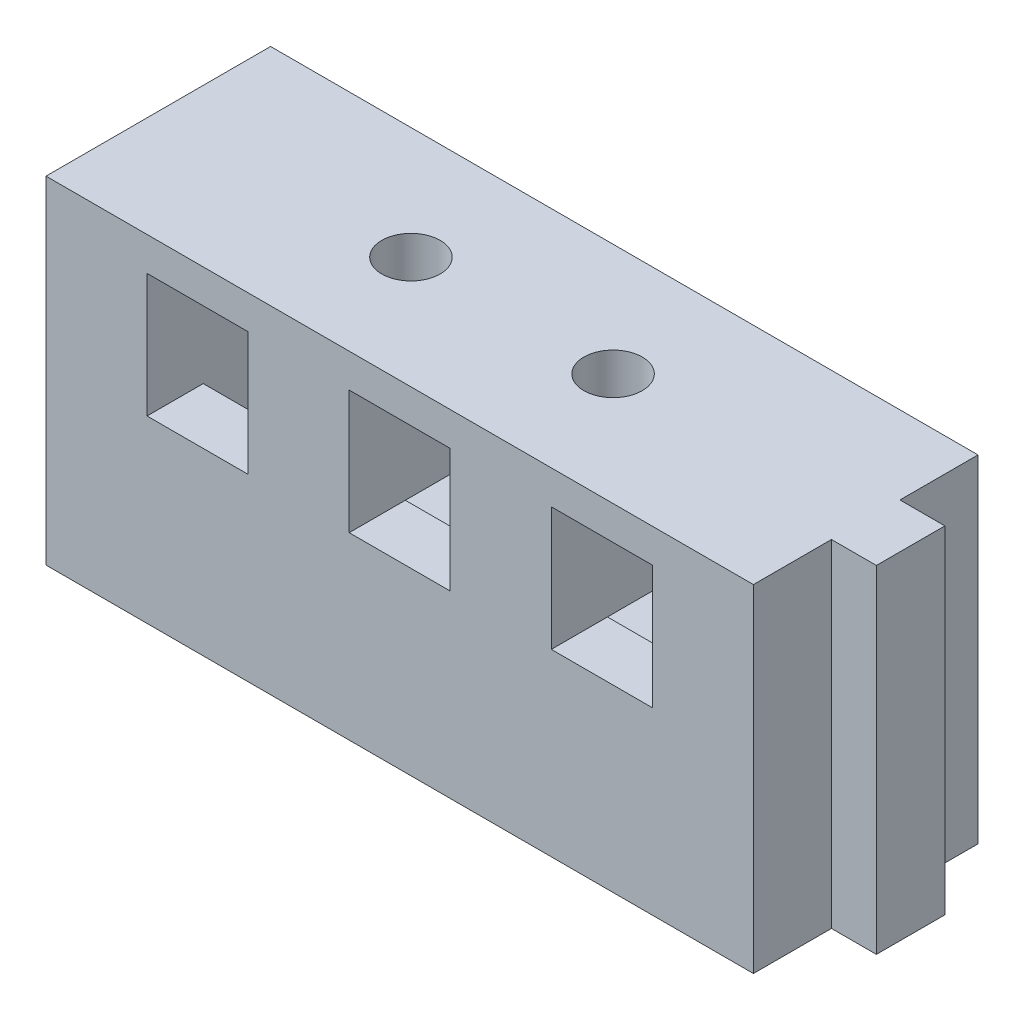
ISO-10303-21;
HEADER;
FILE_DESCRIPTION(('STEP AP214'),'2;1');
FILE_NAME('part.step','',(''),(''),'','','');
FILE_SCHEMA(('AUTOMOTIVE_DESIGN { 1 0 10303 214 1 1 1 1 }'));
ENDSEC;
DATA;
#1=APPLICATION_CONTEXT('core data for automotive mechanical design processes');
#2=APPLICATION_PROTOCOL_DEFINITION('international standard','automotive_design',2000,#1);
#3=PRODUCT_CONTEXT('',#1,'mechanical');
#4=PRODUCT('Part','Part','',(#3));
#5=PRODUCT_RELATED_PRODUCT_CATEGORY('part','',(#4));
#6=PRODUCT_DEFINITION_FORMATION('','',#4);
#7=PRODUCT_DEFINITION_CONTEXT('part definition',#1,'design');
#8=PRODUCT_DEFINITION('design','',#6,#7);
#9=PRODUCT_DEFINITION_SHAPE('','',#8);
#10=(LENGTH_UNIT() NAMED_UNIT(*) SI_UNIT(.MILLI.,.METRE.));
#11=(NAMED_UNIT(*) PLANE_ANGLE_UNIT() SI_UNIT($,.RADIAN.));
#12=(NAMED_UNIT(*) SI_UNIT($,.STERADIAN.) SOLID_ANGLE_UNIT());
#13=UNCERTAINTY_MEASURE_WITH_UNIT(LENGTH_MEASURE(1.E-05),#10,'distance_accuracy_value','');
#14=(GEOMETRIC_REPRESENTATION_CONTEXT(3) GLOBAL_UNCERTAINTY_ASSIGNED_CONTEXT((#13)) GLOBAL_UNIT_ASSIGNED_CONTEXT((#10,
#11,#12)) REPRESENTATION_CONTEXT('',''));
#15=CARTESIAN_POINT('',(0.,0.,0.));
#16=DIRECTION('',(0.,0.,1.));
#17=DIRECTION('',(1.,0.,0.));
#18=AXIS2_PLACEMENT_3D('',#15,#16,#17);
#19=CARTESIAN_POINT('',(50.,0.,20.));
#20=DIRECTION('',(-1.,0.,0.));
#21=DIRECTION('',(0.,0.,1.));
#22=AXIS2_PLACEMENT_3D('',#19,#20,#21);
#23=PLANE('',#22);
#24=DIRECTION('',(0.,1.,0.));
#25=VECTOR('',#24,1.);
#26=CARTESIAN_POINT('',(50.,0.,6.95));
#27=LINE('',#26,#25);
#28=CARTESIAN_POINT('',(50.,0.,6.95));
#29=VERTEX_POINT('',#28);
#30=CARTESIAN_POINT('',(50.,30.,6.95));
#31=VERTEX_POINT('',#30);
#32=EDGE_CURVE('E59',#29,#31,#27,.T.);
#33=ORIENTED_EDGE('',*,*,#32,.F.);
#34=DIRECTION('',(0.,0.,-1.));
#35=VECTOR('',#34,1.);
#36=CARTESIAN_POINT('',(50.,0.,20.));
#37=LINE('',#36,#35);
#38=CARTESIAN_POINT('',(50.,0.,0.));
#39=VERTEX_POINT('',#38);
#40=EDGE_CURVE('E493',#29,#39,#37,.T.);
#41=ORIENTED_EDGE('',*,*,#40,.T.);
#42=DIRECTION('',(0.,1.,0.));
#43=VECTOR('',#42,1.);
#44=CARTESIAN_POINT('',(50.,0.,0.));
#45=LINE('',#44,#43);
#46=CARTESIAN_POINT('',(50.,30.,0.));
#47=VERTEX_POINT('',#46);
#48=EDGE_CURVE('E467',#39,#47,#45,.T.);
#49=ORIENTED_EDGE('',*,*,#48,.T.);
#50=DIRECTION('',(0.,0.,-1.));
#51=VECTOR('',#50,1.);
#52=CARTESIAN_POINT('',(50.,30.,20.));
#53=LINE('',#52,#51);
#54=EDGE_CURVE('E476',#31,#47,#53,.T.);
#55=ORIENTED_EDGE('',*,*,#54,.F.);
#56=EDGE_LOOP('',(#33,#41,#49,#55));
#57=FACE_BOUND('',#56,.T.);
#58=ADVANCED_FACE('F41',(#57),#23,.F.);
#59=CARTESIAN_POINT('',(9.5,100.,10.));
#60=DIRECTION('',(0.,-1.,0.));
#61=DIRECTION('',(0.,0.,-1.));
#62=AXIS2_PLACEMENT_3D('',#59,#60,#61);
#63=CYLINDRICAL_SURFACE('',#62,2.6);
#64=CARTESIAN_POINT('',(9.5,0.,10.));
#65=DIRECTION('',(0.,-1.,0.));
#66=DIRECTION('',(0.,0.,-1.));
#67=AXIS2_PLACEMENT_3D('',#64,#65,#66);
#68=CIRCLE('',#67,2.6);
#69=CARTESIAN_POINT('',(9.5,0.,7.4));
#70=VERTEX_POINT('',#69);
#71=EDGE_CURVE('E277',#70,#70,#68,.T.);
#72=ORIENTED_EDGE('',*,*,#71,.T.);
#73=EDGE_LOOP('',(#72));
#74=FACE_BOUND('',#73,.T.);
#75=CARTESIAN_POINT('',(9.5,3.,10.));
#76=DIRECTION('',(0.,1.,0.));
#77=DIRECTION('',(0.,0.,1.));
#78=AXIS2_PLACEMENT_3D('',#75,#76,#77);
#79=CIRCLE('',#78,2.6);
#80=CARTESIAN_POINT('',(9.5,3.,12.6));
#81=VERTEX_POINT('',#80);
#82=EDGE_CURVE('E45',#81,#81,#79,.F.);
#83=ORIENTED_EDGE('',*,*,#82,.F.);
#84=EDGE_LOOP('',(#83));
#85=FACE_BOUND('',#84,.T.);
#86=ADVANCED_FACE('F508',(#74,#85),#63,.F.);
#87=CARTESIAN_POINT('',(27.5,100.,10.));
#88=DIRECTION('',(0.,-1.,0.));
#89=DIRECTION('',(0.,0.,-1.));
#90=AXIS2_PLACEMENT_3D('',#87,#88,#89);
#91=CYLINDRICAL_SURFACE('',#90,2.6);
#92=CARTESIAN_POINT('',(27.5,0.,10.));
#93=DIRECTION('',(0.,-1.,0.));
#94=DIRECTION('',(0.,0.,-1.));
#95=AXIS2_PLACEMENT_3D('',#92,#93,#94);
#96=CIRCLE('',#95,2.6);
#97=CARTESIAN_POINT('',(27.5,0.,7.4));
#98=VERTEX_POINT('',#97);
#99=EDGE_CURVE('E272',#98,#98,#96,.T.);
#100=ORIENTED_EDGE('',*,*,#99,.T.);
#101=EDGE_LOOP('',(#100));
#102=FACE_BOUND('',#101,.T.);
#103=CARTESIAN_POINT('',(27.5,3.,10.));
#104=DIRECTION('',(0.,1.,0.));
#105=DIRECTION('',(0.,0.,1.));
#106=AXIS2_PLACEMENT_3D('',#103,#104,#105);
#107=CIRCLE('',#106,2.6);
#108=CARTESIAN_POINT('',(27.5,3.,12.6));
#109=VERTEX_POINT('',#108);
#110=EDGE_CURVE('E262',#109,#109,#107,.F.);
#111=ORIENTED_EDGE('',*,*,#110,.F.);
#112=EDGE_LOOP('',(#111));
#113=FACE_BOUND('',#112,.T.);
#114=ADVANCED_FACE('F510',(#102,#113),#91,.F.);
#115=CARTESIAN_POINT('',(-13.,30.,20.));
#116=DIRECTION('',(1.,0.,0.));
#117=DIRECTION('',(0.,0.,-1.));
#118=AXIS2_PLACEMENT_3D('',#115,#116,#117);
#119=PLANE('',#118);
#120=DIRECTION('',(0.,-1.,0.));
#121=VECTOR('',#120,1.);
#122=CARTESIAN_POINT('',(-13.,30.,0.));
#123=LINE('',#122,#121);
#124=CARTESIAN_POINT('',(-13.,30.,0.));
#125=VERTEX_POINT('',#124);
#126=CARTESIAN_POINT('',(-13.,0.,0.));
#127=VERTEX_POINT('',#126);
#128=EDGE_CURVE('E480',#125,#127,#123,.T.);
#129=ORIENTED_EDGE('',*,*,#128,.T.);
#130=DIRECTION('',(0.,0.,-1.));
#131=VECTOR('',#130,1.);
#132=CARTESIAN_POINT('',(-13.,0.,20.));
#133=LINE('',#132,#131);
#134=CARTESIAN_POINT('',(-13.,0.,20.));
#135=VERTEX_POINT('',#134);
#136=EDGE_CURVE('E51',#135,#127,#133,.T.);
#137=ORIENTED_EDGE('',*,*,#136,.F.);
#138=DIRECTION('',(0.,-1.,0.));
#139=VECTOR('',#138,1.);
#140=CARTESIAN_POINT('',(-13.,30.,20.));
#141=LINE('',#140,#139);
#142=CARTESIAN_POINT('',(-13.,30.,20.));
#143=VERTEX_POINT('',#142);
#144=EDGE_CURVE('E466',#143,#135,#141,.T.);
#145=ORIENTED_EDGE('',*,*,#144,.F.);
#146=DIRECTION('',(0.,0.,-1.));
#147=VECTOR('',#146,1.);
#148=CARTESIAN_POINT('',(-13.,30.,20.));
#149=LINE('',#148,#147);
#150=EDGE_CURVE('E11',#143,#125,#149,.T.);
#151=ORIENTED_EDGE('',*,*,#150,.T.);
#152=EDGE_LOOP('',(#129,#137,#145,#151));
#153=FACE_BOUND('',#152,.T.);
#154=ADVANCED_FACE('F518',(#153),#119,.F.);
#155=CARTESIAN_POINT('',(50.,0.,20.));
#156=VERTEX_POINT('',#155);
#157=CARTESIAN_POINT('',(50.,0.,13.05));
#158=VERTEX_POINT('',#157);
#159=EDGE_CURVE('E67',#156,#158,#37,.T.);
#160=ORIENTED_EDGE('',*,*,#159,.T.);
#161=DIRECTION('',(0.,1.,0.));
#162=VECTOR('',#161,1.);
#163=CARTESIAN_POINT('',(50.,0.,13.05));
#164=LINE('',#163,#162);
#165=CARTESIAN_POINT('',(50.,30.,13.05));
#166=VERTEX_POINT('',#165);
#167=EDGE_CURVE('E218',#158,#166,#164,.T.);
#168=ORIENTED_EDGE('',*,*,#167,.T.);
#169=CARTESIAN_POINT('',(50.,30.,20.));
#170=VERTEX_POINT('',#169);
#171=EDGE_CURVE('E489',#170,#166,#53,.T.);
#172=ORIENTED_EDGE('',*,*,#171,.F.);
#173=DIRECTION('',(0.,1.,0.));
#174=VECTOR('',#173,1.);
#175=CARTESIAN_POINT('',(50.,0.,20.));
#176=LINE('',#175,#174);
#177=EDGE_CURVE('E473',#156,#170,#176,.T.);
#178=ORIENTED_EDGE('',*,*,#177,.F.);
#179=EDGE_LOOP('',(#160,#168,#172,#178));
#180=FACE_BOUND('',#179,.T.);
#181=ADVANCED_FACE('F523',(#180),#23,.F.);
#182=CARTESIAN_POINT('',(14.,15.9999999999999,20.));
#183=DIRECTION('',(0.,1.,0.));
#184=DIRECTION('',(0.,0.,1.));
#185=AXIS2_PLACEMENT_3D('',#182,#183,#184);
#186=PLANE('',#185);
#187=DIRECTION('',(0.,0.,-1.));
#188=VECTOR('',#187,1.);
#189=CARTESIAN_POINT('',(23.,15.9999999999999,20.));
#190=LINE('',#189,#188);
#191=CARTESIAN_POINT('',(23.,15.9999999999999,20.));
#192=VERTEX_POINT('',#191);
#193=CARTESIAN_POINT('',(23.,15.9999999999998,15.));
#194=VERTEX_POINT('',#193);
#195=EDGE_CURVE('E453',#192,#194,#190,.T.);
#196=ORIENTED_EDGE('',*,*,#195,.T.);
#197=DIRECTION('',(1.,0.,0.));
#198=VECTOR('',#197,1.);
#199=CARTESIAN_POINT('',(0.,15.9999999999998,15.));
#200=LINE('',#199,#198);
#201=CARTESIAN_POINT('',(14.,15.9999999999998,15.));
#202=VERTEX_POINT('',#201);
#203=EDGE_CURVE('E666',#202,#194,#200,.T.);
#204=ORIENTED_EDGE('',*,*,#203,.F.);
#205=DIRECTION('',(0.,0.,-1.));
#206=VECTOR('',#205,1.);
#207=CARTESIAN_POINT('',(14.,15.9999999999999,20.));
#208=LINE('',#207,#206);
#209=CARTESIAN_POINT('',(14.,15.9999999999999,20.));
#210=VERTEX_POINT('',#209);
#211=EDGE_CURVE('E457',#210,#202,#208,.T.);
#212=ORIENTED_EDGE('',*,*,#211,.F.);
#213=DIRECTION('',(1.,0.,0.));
#214=VECTOR('',#213,1.);
#215=CARTESIAN_POINT('',(14.,15.9999999999999,20.));
#216=LINE('',#215,#214);
#217=EDGE_CURVE('E425',#210,#192,#216,.T.);
#218=ORIENTED_EDGE('',*,*,#217,.T.);
#219=EDGE_LOOP('',(#196,#204,#212,#218));
#220=FACE_BOUND('',#219,.T.);
#221=ADVANCED_FACE('F559',(#220),#186,.T.);
#222=CARTESIAN_POINT('',(-4.,15.9999999999998,20.));
#223=DIRECTION('',(0.,1.,0.));
#224=DIRECTION('',(0.,0.,1.));
#225=AXIS2_PLACEMENT_3D('',#222,#223,#224);
#226=PLANE('',#225);
#227=DIRECTION('',(0.,0.,-1.));
#228=VECTOR('',#227,1.);
#229=CARTESIAN_POINT('',(5.,15.9999999999998,20.));
#230=LINE('',#229,#228);
#231=CARTESIAN_POINT('',(5.,15.9999999999998,20.));
#232=VERTEX_POINT('',#231);
#233=CARTESIAN_POINT('',(5.,15.9999999999998,15.));
#234=VERTEX_POINT('',#233);
#235=EDGE_CURVE('E413',#232,#234,#230,.T.);
#236=ORIENTED_EDGE('',*,*,#235,.T.);
#237=CARTESIAN_POINT('',(-4.,15.9999999999998,15.));
#238=VERTEX_POINT('',#237);
#239=EDGE_CURVE('E324',#238,#234,#200,.T.);
#240=ORIENTED_EDGE('',*,*,#239,.F.);
#241=DIRECTION('',(0.,0.,-1.));
#242=VECTOR('',#241,1.);
#243=CARTESIAN_POINT('',(-4.,15.9999999999998,20.));
#244=LINE('',#243,#242);
#245=CARTESIAN_POINT('',(-4.,15.9999999999998,20.));
#246=VERTEX_POINT('',#245);
#247=EDGE_CURVE('E417',#246,#238,#244,.T.);
#248=ORIENTED_EDGE('',*,*,#247,.F.);
#249=DIRECTION('',(1.,0.,0.));
#250=VECTOR('',#249,1.);
#251=CARTESIAN_POINT('',(-4.,15.9999999999998,20.));
#252=LINE('',#251,#250);
#253=EDGE_CURVE('E386',#246,#232,#252,.T.);
#254=ORIENTED_EDGE('',*,*,#253,.T.);
#255=EDGE_LOOP('',(#236,#240,#248,#254));
#256=FACE_BOUND('',#255,.T.);
#257=ADVANCED_FACE('F564',(#256),#226,.T.);
#258=CARTESIAN_POINT('',(32.,16.,20.));
#259=DIRECTION('',(0.,1.,0.));
#260=DIRECTION('',(0.,0.,1.));
#261=AXIS2_PLACEMENT_3D('',#258,#259,#260);
#262=PLANE('',#261);
#263=DIRECTION('',(0.,0.,-1.));
#264=VECTOR('',#263,1.);
#265=CARTESIAN_POINT('',(41.,16.,20.));
#266=LINE('',#265,#264);
#267=CARTESIAN_POINT('',(41.,16.,20.));
#268=VERTEX_POINT('',#267);
#269=CARTESIAN_POINT('',(41.,15.9999999999998,15.));
#270=VERTEX_POINT('',#269);
#271=EDGE_CURVE('E375',#268,#270,#266,.T.);
#272=ORIENTED_EDGE('',*,*,#271,.T.);
#273=CARTESIAN_POINT('',(32.,15.9999999999998,15.));
#274=VERTEX_POINT('',#273);
#275=EDGE_CURVE('E317',#274,#270,#200,.T.);
#276=ORIENTED_EDGE('',*,*,#275,.F.);
#277=DIRECTION('',(0.,0.,-1.));
#278=VECTOR('',#277,1.);
#279=CARTESIAN_POINT('',(32.,16.,20.));
#280=LINE('',#279,#278);
#281=CARTESIAN_POINT('',(32.,16.,20.));
#282=VERTEX_POINT('',#281);
#283=EDGE_CURVE('E378',#282,#274,#280,.T.);
#284=ORIENTED_EDGE('',*,*,#283,.F.);
#285=DIRECTION('',(1.,0.,0.));
#286=VECTOR('',#285,1.);
#287=CARTESIAN_POINT('',(32.,16.,20.));
#288=LINE('',#287,#286);
#289=EDGE_CURVE('E347',#282,#268,#288,.T.);
#290=ORIENTED_EDGE('',*,*,#289,.T.);
#291=EDGE_LOOP('',(#272,#276,#284,#290));
#292=FACE_BOUND('',#291,.T.);
#293=ADVANCED_FACE('F590',(#292),#262,.T.);
#294=CARTESIAN_POINT('',(0.,0.,20.));
#295=DIRECTION('',(0.,0.,1.));
#296=DIRECTION('',(1.,0.,0.));
#297=AXIS2_PLACEMENT_3D('',#294,#295,#296);
#298=PLANE('',#297);
#299=DIRECTION('',(-1.,0.,0.));
#300=VECTOR('',#299,1.);
#301=CARTESIAN_POINT('',(-13.,30.,20.));
#302=LINE('',#301,#300);
#303=EDGE_CURVE('E462',#170,#143,#302,.T.);
#304=ORIENTED_EDGE('',*,*,#303,.T.);
#305=ORIENTED_EDGE('',*,*,#144,.T.);
#306=DIRECTION('',(1.,0.,0.));
#307=VECTOR('',#306,1.);
#308=CARTESIAN_POINT('',(-13.,0.,20.));
#309=LINE('',#308,#307);
#310=EDGE_CURVE('E470',#135,#156,#309,.T.);
#311=ORIENTED_EDGE('',*,*,#310,.T.);
#312=ORIENTED_EDGE('',*,*,#177,.T.);
#313=EDGE_LOOP('',(#304,#305,#311,#312));
#314=FACE_BOUND('',#313,.T.);
#315=ORIENTED_EDGE('',*,*,#217,.F.);
#316=DIRECTION('',(0.,-1.,0.));
#317=VECTOR('',#316,1.);
#318=CARTESIAN_POINT('',(14.,26.9999999999999,20.));
#319=LINE('',#318,#317);
#320=CARTESIAN_POINT('',(14.,26.9999999999999,20.));
#321=VERTEX_POINT('',#320);
#322=EDGE_CURVE('E422',#321,#210,#319,.T.);
#323=ORIENTED_EDGE('',*,*,#322,.F.);
#324=DIRECTION('',(-1.,0.,0.));
#325=VECTOR('',#324,1.);
#326=CARTESIAN_POINT('',(14.,26.9999999999999,20.));
#327=LINE('',#326,#325);
#328=CARTESIAN_POINT('',(23.,26.9999999999999,20.));
#329=VERTEX_POINT('',#328);
#330=EDGE_CURVE('E433',#329,#321,#327,.T.);
#331=ORIENTED_EDGE('',*,*,#330,.F.);
#332=DIRECTION('',(0.,1.,0.));
#333=VECTOR('',#332,1.);
#334=CARTESIAN_POINT('',(23.,26.9999999999999,20.));
#335=LINE('',#334,#333);
#336=EDGE_CURVE('E429',#192,#329,#335,.T.);
#337=ORIENTED_EDGE('',*,*,#336,.F.);
#338=EDGE_LOOP('',(#315,#323,#331,#337));
#339=FACE_BOUND('',#338,.T.);
#340=ORIENTED_EDGE('',*,*,#253,.F.);
#341=DIRECTION('',(0.,-1.,0.));
#342=VECTOR('',#341,1.);
#343=CARTESIAN_POINT('',(-4.,26.9999999999998,20.));
#344=LINE('',#343,#342);
#345=CARTESIAN_POINT('',(-4.,26.9999999999998,20.));
#346=VERTEX_POINT('',#345);
#347=EDGE_CURVE('E383',#346,#246,#344,.T.);
#348=ORIENTED_EDGE('',*,*,#347,.F.);
#349=DIRECTION('',(-1.,0.,0.));
#350=VECTOR('',#349,1.);
#351=CARTESIAN_POINT('',(-4.,26.9999999999998,20.));
#352=LINE('',#351,#350);
#353=CARTESIAN_POINT('',(5.,26.9999999999998,20.));
#354=VERTEX_POINT('',#353);
#355=EDGE_CURVE('E394',#354,#346,#352,.T.);
#356=ORIENTED_EDGE('',*,*,#355,.F.);
#357=DIRECTION('',(0.,1.,0.));
#358=VECTOR('',#357,1.);
#359=CARTESIAN_POINT('',(5.,26.9999999999998,20.));
#360=LINE('',#359,#358);
#361=EDGE_CURVE('E390',#232,#354,#360,.T.);
#362=ORIENTED_EDGE('',*,*,#361,.F.);
#363=EDGE_LOOP('',(#340,#348,#356,#362));
#364=FACE_BOUND('',#363,.T.);
#365=ORIENTED_EDGE('',*,*,#289,.F.);
#366=DIRECTION('',(0.,-1.,0.));
#367=VECTOR('',#366,1.);
#368=CARTESIAN_POINT('',(32.,27.,20.));
#369=LINE('',#368,#367);
#370=CARTESIAN_POINT('',(32.,27.,20.));
#371=VERTEX_POINT('',#370);
#372=EDGE_CURVE('E344',#371,#282,#369,.T.);
#373=ORIENTED_EDGE('',*,*,#372,.F.);
#374=DIRECTION('',(-1.,0.,0.));
#375=VECTOR('',#374,1.);
#376=CARTESIAN_POINT('',(32.,27.,20.));
#377=LINE('',#376,#375);
#378=CARTESIAN_POINT('',(41.,27.,20.));
#379=VERTEX_POINT('',#378);
#380=EDGE_CURVE('E355',#379,#371,#377,.T.);
#381=ORIENTED_EDGE('',*,*,#380,.F.);
#382=DIRECTION('',(0.,1.,0.));
#383=VECTOR('',#382,1.);
#384=CARTESIAN_POINT('',(41.,27.,20.));
#385=LINE('',#384,#383);
#386=EDGE_CURVE('E351',#268,#379,#385,.T.);
#387=ORIENTED_EDGE('',*,*,#386,.F.);
#388=EDGE_LOOP('',(#365,#373,#381,#387));
#389=FACE_BOUND('',#388,.T.);
#390=ADVANCED_FACE('F555',(#314,#339,#364,#389),#298,.T.);
#391=CARTESIAN_POINT('',(0.,0.,0.));
#392=DIRECTION('',(0.,0.,1.));
#393=DIRECTION('',(1.,0.,0.));
#394=AXIS2_PLACEMENT_3D('',#391,#392,#393);
#395=PLANE('',#394);
#396=DIRECTION('',(0.,-1.,0.));
#397=VECTOR('',#396,1.);
#398=CARTESIAN_POINT('',(-4.,26.9999999999998,0.));
#399=LINE('',#398,#397);
#400=CARTESIAN_POINT('',(-4.,26.9999999999998,0.));
#401=VERTEX_POINT('',#400);
#402=CARTESIAN_POINT('',(-4.,5.,0.));
#403=VERTEX_POINT('',#402);
#404=EDGE_CURVE('E382',#401,#403,#399,.T.);
#405=ORIENTED_EDGE('',*,*,#404,.T.);
#406=DIRECTION('',(1.,0.,0.));
#407=VECTOR('',#406,1.);
#408=CARTESIAN_POINT('',(0.,5.,0.));
#409=LINE('',#408,#407);
#410=CARTESIAN_POINT('',(41.,5.,0.));
#411=VERTEX_POINT('',#410);
#412=EDGE_CURVE('E312',#403,#411,#409,.T.);
#413=ORIENTED_EDGE('',*,*,#412,.T.);
#414=DIRECTION('',(0.,1.,0.));
#415=VECTOR('',#414,1.);
#416=CARTESIAN_POINT('',(41.,27.,0.));
#417=LINE('',#416,#415);
#418=CARTESIAN_POINT('',(41.,27.,0.));
#419=VERTEX_POINT('',#418);
#420=EDGE_CURVE('E362',#411,#419,#417,.T.);
#421=ORIENTED_EDGE('',*,*,#420,.T.);
#422=DIRECTION('',(-1.,0.,0.));
#423=VECTOR('',#422,1.);
#424=CARTESIAN_POINT('',(32.,27.,0.));
#425=LINE('',#424,#423);
#426=CARTESIAN_POINT('',(32.,27.,0.));
#427=VERTEX_POINT('',#426);
#428=EDGE_CURVE('E348',#419,#427,#425,.T.);
#429=ORIENTED_EDGE('',*,*,#428,.T.);
#430=DIRECTION('',(0.,-1.,0.));
#431=VECTOR('',#430,1.);
#432=CARTESIAN_POINT('',(32.,27.,0.));
#433=LINE('',#432,#431);
#434=CARTESIAN_POINT('',(32.,15.9999999999998,0.));
#435=VERTEX_POINT('',#434);
#436=EDGE_CURVE('E343',#427,#435,#433,.T.);
#437=ORIENTED_EDGE('',*,*,#436,.T.);
#438=DIRECTION('',(1.,0.,0.));
#439=VECTOR('',#438,1.);
#440=CARTESIAN_POINT('',(0.,15.9999999999998,0.));
#441=LINE('',#440,#439);
#442=CARTESIAN_POINT('',(23.,15.9999999999998,0.));
#443=VERTEX_POINT('',#442);
#444=EDGE_CURVE('E327',#443,#435,#441,.T.);
#445=ORIENTED_EDGE('',*,*,#444,.F.);
#446=DIRECTION('',(0.,1.,0.));
#447=VECTOR('',#446,1.);
#448=CARTESIAN_POINT('',(23.,26.9999999999999,0.));
#449=LINE('',#448,#447);
#450=CARTESIAN_POINT('',(23.,26.9999999999999,0.));
#451=VERTEX_POINT('',#450);
#452=EDGE_CURVE('E440',#443,#451,#449,.T.);
#453=ORIENTED_EDGE('',*,*,#452,.T.);
#454=DIRECTION('',(-1.,0.,0.));
#455=VECTOR('',#454,1.);
#456=CARTESIAN_POINT('',(14.,26.9999999999999,0.));
#457=LINE('',#456,#455);
#458=CARTESIAN_POINT('',(14.,26.9999999999999,0.));
#459=VERTEX_POINT('',#458);
#460=EDGE_CURVE('E426',#451,#459,#457,.T.);
#461=ORIENTED_EDGE('',*,*,#460,.T.);
#462=DIRECTION('',(0.,-1.,0.));
#463=VECTOR('',#462,1.);
#464=CARTESIAN_POINT('',(14.,26.9999999999999,0.));
#465=LINE('',#464,#463);
#466=CARTESIAN_POINT('',(14.,15.9999999999998,0.));
#467=VERTEX_POINT('',#466);
#468=EDGE_CURVE('E421',#459,#467,#465,.T.);
#469=ORIENTED_EDGE('',*,*,#468,.T.);
#470=CARTESIAN_POINT('',(5.,15.9999999999998,0.));
#471=VERTEX_POINT('',#470);
#472=EDGE_CURVE('E330',#471,#467,#441,.T.);
#473=ORIENTED_EDGE('',*,*,#472,.F.);
#474=DIRECTION('',(0.,1.,0.));
#475=VECTOR('',#474,1.);
#476=CARTESIAN_POINT('',(5.,26.9999999999998,0.));
#477=LINE('',#476,#475);
#478=CARTESIAN_POINT('',(5.,26.9999999999998,0.));
#479=VERTEX_POINT('',#478);
#480=EDGE_CURVE('E400',#471,#479,#477,.T.);
#481=ORIENTED_EDGE('',*,*,#480,.T.);
#482=DIRECTION('',(-1.,0.,0.));
#483=VECTOR('',#482,1.);
#484=CARTESIAN_POINT('',(-4.,26.9999999999998,0.));
#485=LINE('',#484,#483);
#486=EDGE_CURVE('E387',#479,#401,#485,.T.);
#487=ORIENTED_EDGE('',*,*,#486,.T.);
#488=EDGE_LOOP('',(#405,#413,#421,#429,#437,#445,#453,#461,#469,#473,#481,#487));
#489=FACE_BOUND('',#488,.T.);
#490=DIRECTION('',(-1.,0.,0.));
#491=VECTOR('',#490,1.);
#492=CARTESIAN_POINT('',(-13.,30.,0.));
#493=LINE('',#492,#491);
#494=EDGE_CURVE('E461',#47,#125,#493,.T.);
#495=ORIENTED_EDGE('',*,*,#494,.F.);
#496=ORIENTED_EDGE('',*,*,#48,.F.);
#497=DIRECTION('',(1.,0.,0.));
#498=VECTOR('',#497,1.);
#499=CARTESIAN_POINT('',(-13.,0.,0.));
#500=LINE('',#499,#498);
#501=EDGE_CURVE('E483',#127,#39,#500,.T.);
#502=ORIENTED_EDGE('',*,*,#501,.F.);
#503=ORIENTED_EDGE('',*,*,#128,.F.);
#504=EDGE_LOOP('',(#495,#496,#502,#503));
#505=FACE_BOUND('',#504,.T.);
#506=ADVANCED_FACE('F543',(#489,#505),#395,.F.);
#507=CARTESIAN_POINT('',(-13.,30.,20.));
#508=DIRECTION('',(0.,-1.,0.));
#509=DIRECTION('',(0.,0.,-1.));
#510=AXIS2_PLACEMENT_3D('',#507,#508,#509);
#511=PLANE('',#510);
#512=CARTESIAN_POINT('',(27.5,30.,10.));
#513=DIRECTION('',(0.,-1.,0.));
#514=DIRECTION('',(0.,0.,-1.));
#515=AXIS2_PLACEMENT_3D('',#512,#513,#514);
#516=CIRCLE('',#515,2.6);
#517=CARTESIAN_POINT('',(27.5,30.,7.4));
#518=VERTEX_POINT('',#517);
#519=EDGE_CURVE('E292',#518,#518,#516,.T.);
#520=ORIENTED_EDGE('',*,*,#519,.T.);
#521=EDGE_LOOP('',(#520));
#522=FACE_BOUND('',#521,.T.);
#523=CARTESIAN_POINT('',(9.5,30.,10.));
#524=DIRECTION('',(0.,-1.,0.));
#525=DIRECTION('',(0.,0.,-1.));
#526=AXIS2_PLACEMENT_3D('',#523,#524,#525);
#527=CIRCLE('',#526,2.6);
#528=CARTESIAN_POINT('',(9.5,30.,7.4));
#529=VERTEX_POINT('',#528);
#530=EDGE_CURVE('E284',#529,#529,#527,.T.);
#531=ORIENTED_EDGE('',*,*,#530,.T.);
#532=EDGE_LOOP('',(#531));
#533=FACE_BOUND('',#532,.T.);
#534=ORIENTED_EDGE('',*,*,#494,.T.);
#535=ORIENTED_EDGE('',*,*,#150,.F.);
#536=ORIENTED_EDGE('',*,*,#303,.F.);
#537=ORIENTED_EDGE('',*,*,#171,.T.);
#538=DIRECTION('',(-1.,0.,0.));
#539=VECTOR('',#538,1.);
#540=CARTESIAN_POINT('',(54.,30.,13.05));
#541=LINE('',#540,#539);
#542=CARTESIAN_POINT('',(54.,30.,13.05));
#543=VERTEX_POINT('',#542);
#544=EDGE_CURVE('E247',#543,#166,#541,.T.);
#545=ORIENTED_EDGE('',*,*,#544,.F.);
#546=DIRECTION('',(0.,0.,1.));
#547=VECTOR('',#546,1.);
#548=CARTESIAN_POINT('',(54.,30.,0.));
#549=LINE('',#548,#547);
#550=CARTESIAN_POINT('',(54.,30.,6.95));
#551=VERTEX_POINT('',#550);
#552=EDGE_CURVE('E236',#551,#543,#549,.T.);
#553=ORIENTED_EDGE('',*,*,#552,.F.);
#554=DIRECTION('',(-1.,0.,0.));
#555=VECTOR('',#554,1.);
#556=CARTESIAN_POINT('',(54.,30.,6.95));
#557=LINE('',#556,#555);
#558=EDGE_CURVE('E252',#551,#31,#557,.T.);
#559=ORIENTED_EDGE('',*,*,#558,.T.);
#560=ORIENTED_EDGE('',*,*,#54,.T.);
#561=EDGE_LOOP('',(#534,#535,#536,#537,#545,#553,#559,#560));
#562=FACE_BOUND('',#561,.T.);
#563=ADVANCED_FACE('F43',(#522,#533,#562),#511,.F.);
#564=CARTESIAN_POINT('',(-13.,0.,20.));
#565=DIRECTION('',(0.,1.,0.));
#566=DIRECTION('',(0.,0.,1.));
#567=AXIS2_PLACEMENT_3D('',#564,#565,#566);
#568=PLANE('',#567);
#569=ORIENTED_EDGE('',*,*,#99,.F.);
#570=EDGE_LOOP('',(#569));
#571=FACE_BOUND('',#570,.T.);
#572=ORIENTED_EDGE('',*,*,#71,.F.);
#573=EDGE_LOOP('',(#572));
#574=FACE_BOUND('',#573,.T.);
#575=ORIENTED_EDGE('',*,*,#501,.T.);
#576=ORIENTED_EDGE('',*,*,#40,.F.);
#577=DIRECTION('',(-1.,0.,0.));
#578=VECTOR('',#577,1.);
#579=CARTESIAN_POINT('',(54.,0.,6.95));
#580=LINE('',#579,#578);
#581=CARTESIAN_POINT('',(54.,0.,6.95));
#582=VERTEX_POINT('',#581);
#583=EDGE_CURVE('E222',#582,#29,#580,.T.);
#584=ORIENTED_EDGE('',*,*,#583,.F.);
#585=DIRECTION('',(0.,0.,-1.));
#586=VECTOR('',#585,1.);
#587=CARTESIAN_POINT('',(54.,0.,0.));
#588=LINE('',#587,#586);
#589=CARTESIAN_POINT('',(54.,0.,13.05));
#590=VERTEX_POINT('',#589);
#591=EDGE_CURVE('E225',#590,#582,#588,.T.);
#592=ORIENTED_EDGE('',*,*,#591,.F.);
#593=DIRECTION('',(-1.,0.,0.));
#594=VECTOR('',#593,1.);
#595=CARTESIAN_POINT('',(54.,0.,13.05));
#596=LINE('',#595,#594);
#597=EDGE_CURVE('E212',#590,#158,#596,.T.);
#598=ORIENTED_EDGE('',*,*,#597,.T.);
#599=ORIENTED_EDGE('',*,*,#159,.F.);
#600=ORIENTED_EDGE('',*,*,#310,.F.);
#601=ORIENTED_EDGE('',*,*,#136,.T.);
#602=EDGE_LOOP('',(#575,#576,#584,#592,#598,#599,#600,#601));
#603=FACE_BOUND('',#602,.T.);
#604=ADVANCED_FACE('F227',(#571,#574,#603),#568,.F.);
#605=CARTESIAN_POINT('',(14.,26.9999999999999,20.));
#606=DIRECTION('',(1.,0.,0.));
#607=DIRECTION('',(0.,0.,-1.));
#608=AXIS2_PLACEMENT_3D('',#605,#606,#607);
#609=PLANE('',#608);
#610=ORIENTED_EDGE('',*,*,#468,.F.);
#611=DIRECTION('',(0.,0.,-1.));
#612=VECTOR('',#611,1.);
#613=CARTESIAN_POINT('',(14.,26.9999999999999,20.));
#614=LINE('',#613,#612);
#615=EDGE_CURVE('E436',#321,#459,#614,.T.);
#616=ORIENTED_EDGE('',*,*,#615,.F.);
#617=ORIENTED_EDGE('',*,*,#322,.T.);
#618=ORIENTED_EDGE('',*,*,#211,.T.);
#619=DIRECTION('',(0.,0.,1.));
#620=VECTOR('',#619,1.);
#621=CARTESIAN_POINT('',(14.,15.9999999999998,20.));
#622=LINE('',#621,#620);
#623=EDGE_CURVE('E340',#467,#202,#622,.T.);
#624=ORIENTED_EDGE('',*,*,#623,.F.);
#625=EDGE_LOOP('',(#610,#616,#617,#618,#624));
#626=FACE_BOUND('',#625,.T.);
#627=ADVANCED_FACE('F571',(#626),#609,.T.);
#628=CARTESIAN_POINT('',(23.,26.9999999999999,20.));
#629=DIRECTION('',(-1.,0.,0.));
#630=DIRECTION('',(0.,0.,1.));
#631=AXIS2_PLACEMENT_3D('',#628,#629,#630);
#632=PLANE('',#631);
#633=ORIENTED_EDGE('',*,*,#452,.F.);
#634=DIRECTION('',(0.,0.,-1.));
#635=VECTOR('',#634,1.);
#636=CARTESIAN_POINT('',(23.,15.9999999999998,20.));
#637=LINE('',#636,#635);
#638=EDGE_CURVE('E337',#194,#443,#637,.T.);
#639=ORIENTED_EDGE('',*,*,#638,.F.);
#640=ORIENTED_EDGE('',*,*,#195,.F.);
#641=ORIENTED_EDGE('',*,*,#336,.T.);
#642=DIRECTION('',(0.,0.,-1.));
#643=VECTOR('',#642,1.);
#644=CARTESIAN_POINT('',(23.,26.9999999999999,20.));
#645=LINE('',#644,#643);
#646=EDGE_CURVE('E450',#329,#451,#645,.T.);
#647=ORIENTED_EDGE('',*,*,#646,.T.);
#648=EDGE_LOOP('',(#633,#639,#640,#641,#647));
#649=FACE_BOUND('',#648,.T.);
#650=ADVANCED_FACE('F576',(#649),#632,.T.);
#651=CARTESIAN_POINT('',(14.,26.9999999999999,20.));
#652=DIRECTION('',(0.,-1.,0.));
#653=DIRECTION('',(1.,0.,0.));
#654=AXIS2_PLACEMENT_3D('',#651,#652,#653);
#655=PLANE('',#654);
#656=ORIENTED_EDGE('',*,*,#460,.F.);
#657=ORIENTED_EDGE('',*,*,#646,.F.);
#658=ORIENTED_EDGE('',*,*,#330,.T.);
#659=ORIENTED_EDGE('',*,*,#615,.T.);
#660=EDGE_LOOP('',(#656,#657,#658,#659));
#661=FACE_BOUND('',#660,.T.);
#662=ADVANCED_FACE('F586',(#661),#655,.T.);
#663=CARTESIAN_POINT('',(-4.,26.9999999999998,20.));
#664=DIRECTION('',(1.,0.,0.));
#665=DIRECTION('',(0.,0.,-1.));
#666=AXIS2_PLACEMENT_3D('',#663,#664,#665);
#667=PLANE('',#666);
#668=ORIENTED_EDGE('',*,*,#404,.F.);
#669=DIRECTION('',(0.,0.,-1.));
#670=VECTOR('',#669,1.);
#671=CARTESIAN_POINT('',(-4.,26.9999999999998,20.));
#672=LINE('',#671,#670);
#673=EDGE_CURVE('E397',#346,#401,#672,.T.);
#674=ORIENTED_EDGE('',*,*,#673,.F.);
#675=ORIENTED_EDGE('',*,*,#347,.T.);
#676=ORIENTED_EDGE('',*,*,#247,.T.);
#677=DIRECTION('',(0.,-1.,0.));
#678=VECTOR('',#677,1.);
#679=CARTESIAN_POINT('',(-4.,15.9999999999998,15.));
#680=LINE('',#679,#678);
#681=CARTESIAN_POINT('',(-4.,5.,15.));
#682=VERTEX_POINT('',#681);
#683=EDGE_CURVE('E296',#238,#682,#680,.T.);
#684=ORIENTED_EDGE('',*,*,#683,.T.);
#685=DIRECTION('',(0.,0.,-1.));
#686=VECTOR('',#685,1.);
#687=CARTESIAN_POINT('',(-4.,5.,15.));
#688=LINE('',#687,#686);
#689=EDGE_CURVE('E300',#682,#403,#688,.T.);
#690=ORIENTED_EDGE('',*,*,#689,.T.);
#691=EDGE_LOOP('',(#668,#674,#675,#676,#684,#690));
#692=FACE_BOUND('',#691,.T.);
#693=ADVANCED_FACE('F617',(#692),#667,.T.);
#694=CARTESIAN_POINT('',(5.,26.9999999999998,20.));
#695=DIRECTION('',(-1.,0.,0.));
#696=DIRECTION('',(0.,0.,1.));
#697=AXIS2_PLACEMENT_3D('',#694,#695,#696);
#698=PLANE('',#697);
#699=ORIENTED_EDGE('',*,*,#480,.F.);
#700=DIRECTION('',(0.,0.,-1.));
#701=VECTOR('',#700,1.);
#702=CARTESIAN_POINT('',(5.,15.9999999999998,20.));
#703=LINE('',#702,#701);
#704=EDGE_CURVE('E334',#234,#471,#703,.T.);
#705=ORIENTED_EDGE('',*,*,#704,.F.);
#706=ORIENTED_EDGE('',*,*,#235,.F.);
#707=ORIENTED_EDGE('',*,*,#361,.T.);
#708=DIRECTION('',(0.,0.,-1.));
#709=VECTOR('',#708,1.);
#710=CARTESIAN_POINT('',(5.,26.9999999999998,20.));
#711=LINE('',#710,#709);
#712=EDGE_CURVE('E410',#354,#479,#711,.T.);
#713=ORIENTED_EDGE('',*,*,#712,.T.);
#714=EDGE_LOOP('',(#699,#705,#706,#707,#713));
#715=FACE_BOUND('',#714,.T.);
#716=ADVANCED_FACE('F614',(#715),#698,.T.);
#717=CARTESIAN_POINT('',(-4.,26.9999999999998,20.));
#718=DIRECTION('',(0.,-1.,0.));
#719=DIRECTION('',(1.,0.,0.));
#720=AXIS2_PLACEMENT_3D('',#717,#718,#719);
#721=PLANE('',#720);
#722=ORIENTED_EDGE('',*,*,#486,.F.);
#723=ORIENTED_EDGE('',*,*,#712,.F.);
#724=ORIENTED_EDGE('',*,*,#355,.T.);
#725=ORIENTED_EDGE('',*,*,#673,.T.);
#726=EDGE_LOOP('',(#722,#723,#724,#725));
#727=FACE_BOUND('',#726,.T.);
#728=ADVANCED_FACE('F610',(#727),#721,.T.);
#729=CARTESIAN_POINT('',(32.,27.,20.));
#730=DIRECTION('',(1.,0.,0.));
#731=DIRECTION('',(0.,0.,-1.));
#732=AXIS2_PLACEMENT_3D('',#729,#730,#731);
#733=PLANE('',#732);
#734=ORIENTED_EDGE('',*,*,#436,.F.);
#735=DIRECTION('',(0.,0.,-1.));
#736=VECTOR('',#735,1.);
#737=CARTESIAN_POINT('',(32.,27.,20.));
#738=LINE('',#737,#736);
#739=EDGE_CURVE('E358',#371,#427,#738,.T.);
#740=ORIENTED_EDGE('',*,*,#739,.F.);
#741=ORIENTED_EDGE('',*,*,#372,.T.);
#742=ORIENTED_EDGE('',*,*,#283,.T.);
#743=DIRECTION('',(0.,0.,1.));
#744=VECTOR('',#743,1.);
#745=CARTESIAN_POINT('',(32.,15.9999999999998,20.));
#746=LINE('',#745,#744);
#747=EDGE_CURVE('E331',#435,#274,#746,.T.);
#748=ORIENTED_EDGE('',*,*,#747,.F.);
#749=EDGE_LOOP('',(#734,#740,#741,#742,#748));
#750=FACE_BOUND('',#749,.T.);
#751=ADVANCED_FACE('F607',(#750),#733,.T.);
#752=CARTESIAN_POINT('',(41.,27.,20.));
#753=DIRECTION('',(-1.,0.,0.));
#754=DIRECTION('',(0.,0.,1.));
#755=AXIS2_PLACEMENT_3D('',#752,#753,#754);
#756=PLANE('',#755);
#757=ORIENTED_EDGE('',*,*,#420,.F.);
#758=DIRECTION('',(0.,0.,-1.));
#759=VECTOR('',#758,1.);
#760=CARTESIAN_POINT('',(41.,5.,15.));
#761=LINE('',#760,#759);
#762=CARTESIAN_POINT('',(41.,5.,15.));
#763=VERTEX_POINT('',#762);
#764=EDGE_CURVE('E308',#763,#411,#761,.T.);
#765=ORIENTED_EDGE('',*,*,#764,.F.);
#766=DIRECTION('',(0.,1.,0.));
#767=VECTOR('',#766,1.);
#768=CARTESIAN_POINT('',(41.,15.9999999999998,15.));
#769=LINE('',#768,#767);
#770=EDGE_CURVE('E304',#763,#270,#769,.T.);
#771=ORIENTED_EDGE('',*,*,#770,.T.);
#772=ORIENTED_EDGE('',*,*,#271,.F.);
#773=ORIENTED_EDGE('',*,*,#386,.T.);
#774=DIRECTION('',(0.,0.,-1.));
#775=VECTOR('',#774,1.);
#776=CARTESIAN_POINT('',(41.,27.,20.));
#777=LINE('',#776,#775);
#778=EDGE_CURVE('E372',#379,#419,#777,.T.);
#779=ORIENTED_EDGE('',*,*,#778,.T.);
#780=EDGE_LOOP('',(#757,#765,#771,#772,#773,#779));
#781=FACE_BOUND('',#780,.T.);
#782=ADVANCED_FACE('F605',(#781),#756,.T.);
#783=CARTESIAN_POINT('',(32.,27.,20.));
#784=DIRECTION('',(0.,-1.,0.));
#785=DIRECTION('',(1.,0.,0.));
#786=AXIS2_PLACEMENT_3D('',#783,#784,#785);
#787=PLANE('',#786);
#788=ORIENTED_EDGE('',*,*,#428,.F.);
#789=ORIENTED_EDGE('',*,*,#778,.F.);
#790=ORIENTED_EDGE('',*,*,#380,.T.);
#791=ORIENTED_EDGE('',*,*,#739,.T.);
#792=EDGE_LOOP('',(#788,#789,#790,#791));
#793=FACE_BOUND('',#792,.T.);
#794=ADVANCED_FACE('F844',(#793),#787,.T.);
#795=CARTESIAN_POINT('',(0.,15.9999999999998,15.));
#796=DIRECTION('',(0.,1.,0.));
#797=DIRECTION('',(0.,0.,1.));
#798=AXIS2_PLACEMENT_3D('',#795,#796,#797);
#799=PLANE('',#798);
#800=CARTESIAN_POINT('',(9.5,15.9999999999998,10.));
#801=DIRECTION('',(0.,1.,0.));
#802=DIRECTION('',(0.,0.,1.));
#803=AXIS2_PLACEMENT_3D('',#800,#801,#802);
#804=CIRCLE('',#803,2.6);
#805=CARTESIAN_POINT('',(9.5,15.9999999999998,12.6));
#806=VERTEX_POINT('',#805);
#807=EDGE_CURVE('E276',#806,#806,#804,.T.);
#808=ORIENTED_EDGE('',*,*,#807,.T.);
#809=EDGE_LOOP('',(#808));
#810=FACE_BOUND('',#809,.T.);
#811=ORIENTED_EDGE('',*,*,#623,.T.);
#812=EDGE_CURVE('E664',#234,#202,#200,.T.);
#813=ORIENTED_EDGE('',*,*,#812,.F.);
#814=ORIENTED_EDGE('',*,*,#704,.T.);
#815=ORIENTED_EDGE('',*,*,#472,.T.);
#816=EDGE_LOOP('',(#811,#813,#814,#815));
#817=FACE_BOUND('',#816,.T.);
#818=ADVANCED_FACE('F853',(#810,#817),#799,.F.);
#819=CARTESIAN_POINT('',(27.5,15.9999999999998,10.));
#820=DIRECTION('',(0.,1.,0.));
#821=DIRECTION('',(0.,0.,1.));
#822=AXIS2_PLACEMENT_3D('',#819,#820,#821);
#823=CIRCLE('',#822,2.6);
#824=CARTESIAN_POINT('',(27.5,15.9999999999998,12.6));
#825=VERTEX_POINT('',#824);
#826=EDGE_CURVE('E288',#825,#825,#823,.T.);
#827=ORIENTED_EDGE('',*,*,#826,.T.);
#828=EDGE_LOOP('',(#827));
#829=FACE_BOUND('',#828,.T.);
#830=ORIENTED_EDGE('',*,*,#638,.T.);
#831=ORIENTED_EDGE('',*,*,#444,.T.);
#832=ORIENTED_EDGE('',*,*,#747,.T.);
#833=EDGE_CURVE('E323',#194,#274,#200,.T.);
#834=ORIENTED_EDGE('',*,*,#833,.F.);
#835=EDGE_LOOP('',(#830,#831,#832,#834));
#836=FACE_BOUND('',#835,.T.);
#837=ADVANCED_FACE('F883',(#829,#836),#799,.F.);
#838=CARTESIAN_POINT('',(0.,5.,15.));
#839=DIRECTION('',(0.,1.,0.));
#840=DIRECTION('',(0.,0.,1.));
#841=AXIS2_PLACEMENT_3D('',#838,#839,#840);
#842=PLANE('',#841);
#843=DIRECTION('',(1.,0.,0.));
#844=VECTOR('',#843,1.);
#845=CARTESIAN_POINT('',(0.,5.,15.));
#846=LINE('',#845,#844);
#847=CARTESIAN_POINT('',(9.5,5.,15.));
#848=VERTEX_POINT('',#847);
#849=EDGE_CURVE('E313',#682,#848,#846,.T.);
#850=ORIENTED_EDGE('',*,*,#849,.T.);
#851=CARTESIAN_POINT('',(9.5,5.,10.));
#852=DIRECTION('',(0.,1.,0.));
#853=DIRECTION('',(0.,0.,1.));
#854=AXIS2_PLACEMENT_3D('',#851,#852,#853);
#855=CIRCLE('',#854,5.);
#856=EDGE_CURVE('E263',#848,#848,#855,.T.);
#857=ORIENTED_EDGE('',*,*,#856,.F.);
#858=CARTESIAN_POINT('',(27.5,5.,15.));
#859=VERTEX_POINT('',#858);
#860=EDGE_CURVE('E318',#848,#859,#846,.T.);
#861=ORIENTED_EDGE('',*,*,#860,.T.);
#862=CARTESIAN_POINT('',(27.5,5.,10.));
#863=DIRECTION('',(0.,1.,0.));
#864=DIRECTION('',(0.,0.,1.));
#865=AXIS2_PLACEMENT_3D('',#862,#863,#864);
#866=CIRCLE('',#865,5.);
#867=EDGE_CURVE('E221',#859,#859,#866,.T.);
#868=ORIENTED_EDGE('',*,*,#867,.F.);
#869=EDGE_CURVE('E319',#859,#763,#846,.T.);
#870=ORIENTED_EDGE('',*,*,#869,.T.);
#871=ORIENTED_EDGE('',*,*,#764,.T.);
#872=ORIENTED_EDGE('',*,*,#412,.F.);
#873=ORIENTED_EDGE('',*,*,#689,.F.);
#874=EDGE_LOOP('',(#850,#857,#861,#868,#870,#871,#872,#873));
#875=FACE_BOUND('',#874,.T.);
#876=ADVANCED_FACE('F653',(#875),#842,.T.);
#877=CARTESIAN_POINT('',(0.,0.,15.));
#878=DIRECTION('',(0.,0.,-1.));
#879=DIRECTION('',(-1.,0.,0.));
#880=AXIS2_PLACEMENT_3D('',#877,#878,#879);
#881=PLANE('',#880);
#882=ORIENTED_EDGE('',*,*,#683,.F.);
#883=ORIENTED_EDGE('',*,*,#239,.T.);
#884=ORIENTED_EDGE('',*,*,#812,.T.);
#885=ORIENTED_EDGE('',*,*,#203,.T.);
#886=ORIENTED_EDGE('',*,*,#833,.T.);
#887=ORIENTED_EDGE('',*,*,#275,.T.);
#888=ORIENTED_EDGE('',*,*,#770,.F.);
#889=ORIENTED_EDGE('',*,*,#869,.F.);
#890=ORIENTED_EDGE('',*,*,#860,.F.);
#891=ORIENTED_EDGE('',*,*,#849,.F.);
#892=EDGE_LOOP('',(#882,#883,#884,#885,#886,#887,#888,#889,#890,#891));
#893=FACE_BOUND('',#892,.T.);
#894=ADVANCED_FACE('F535',(#893),#881,.T.);
#895=ORIENTED_EDGE('',*,*,#826,.F.);
#896=EDGE_LOOP('',(#895));
#897=FACE_BOUND('',#896,.T.);
#898=ORIENTED_EDGE('',*,*,#519,.F.);
#899=EDGE_LOOP('',(#898));
#900=FACE_BOUND('',#899,.T.);
#901=ADVANCED_FACE('F521',(#897,#900),#91,.F.);
#902=ORIENTED_EDGE('',*,*,#807,.F.);
#903=EDGE_LOOP('',(#902));
#904=FACE_BOUND('',#903,.T.);
#905=ORIENTED_EDGE('',*,*,#530,.F.);
#906=EDGE_LOOP('',(#905));
#907=FACE_BOUND('',#906,.T.);
#908=ADVANCED_FACE('F513',(#904,#907),#63,.F.);
#909=CARTESIAN_POINT('',(27.5,3.,10.));
#910=DIRECTION('',(0.,1.,0.));
#911=DIRECTION('',(0.,0.,1.));
#912=AXIS2_PLACEMENT_3D('',#909,#910,#911);
#913=PLANE('',#912);
#914=CARTESIAN_POINT('',(27.5,3.,10.));
#915=DIRECTION('',(0.,1.,0.));
#916=DIRECTION('',(0.,0.,1.));
#917=AXIS2_PLACEMENT_3D('',#914,#915,#916);
#918=CIRCLE('',#917,5.);
#919=CARTESIAN_POINT('',(27.5,3.,15.));
#920=VERTEX_POINT('',#919);
#921=EDGE_CURVE('E266',#920,#920,#918,.T.);
#922=ORIENTED_EDGE('',*,*,#921,.T.);
#923=EDGE_LOOP('',(#922));
#924=FACE_BOUND('',#923,.T.);
#925=ORIENTED_EDGE('',*,*,#110,.T.);
#926=EDGE_LOOP('',(#925));
#927=FACE_BOUND('',#926,.T.);
#928=ADVANCED_FACE('F526',(#924,#927),#913,.T.);
#929=CARTESIAN_POINT('',(27.5,3.,10.));
#930=DIRECTION('',(0.,1.,0.));
#931=DIRECTION('',(0.,0.,1.));
#932=AXIS2_PLACEMENT_3D('',#929,#930,#931);
#933=CYLINDRICAL_SURFACE('',#932,5.);
#934=ORIENTED_EDGE('',*,*,#921,.F.);
#935=EDGE_LOOP('',(#934));
#936=FACE_BOUND('',#935,.T.);
#937=ORIENTED_EDGE('',*,*,#867,.T.);
#938=EDGE_LOOP('',(#937));
#939=FACE_BOUND('',#938,.T.);
#940=ADVANCED_FACE('F532',(#936,#939),#933,.F.);
#941=CARTESIAN_POINT('',(9.5,3.,10.));
#942=DIRECTION('',(0.,1.,0.));
#943=DIRECTION('',(0.,0.,1.));
#944=AXIS2_PLACEMENT_3D('',#941,#942,#943);
#945=PLANE('',#944);
#946=CARTESIAN_POINT('',(9.5,3.,10.));
#947=DIRECTION('',(0.,1.,0.));
#948=DIRECTION('',(0.,0.,1.));
#949=AXIS2_PLACEMENT_3D('',#946,#947,#948);
#950=CIRCLE('',#949,5.);
#951=CARTESIAN_POINT('',(9.5,3.,15.));
#952=VERTEX_POINT('',#951);
#953=EDGE_CURVE('E258',#952,#952,#950,.T.);
#954=ORIENTED_EDGE('',*,*,#953,.T.);
#955=EDGE_LOOP('',(#954));
#956=FACE_BOUND('',#955,.T.);
#957=ORIENTED_EDGE('',*,*,#82,.T.);
#958=EDGE_LOOP('',(#957));
#959=FACE_BOUND('',#958,.T.);
#960=ADVANCED_FACE('F506',(#956,#959),#945,.T.);
#961=CARTESIAN_POINT('',(9.5,3.,10.));
#962=DIRECTION('',(0.,1.,0.));
#963=DIRECTION('',(0.,0.,1.));
#964=AXIS2_PLACEMENT_3D('',#961,#962,#963);
#965=CYLINDRICAL_SURFACE('',#964,5.);
#966=ORIENTED_EDGE('',*,*,#953,.F.);
#967=EDGE_LOOP('',(#966));
#968=FACE_BOUND('',#967,.T.);
#969=ORIENTED_EDGE('',*,*,#856,.T.);
#970=EDGE_LOOP('',(#969));
#971=FACE_BOUND('',#970,.T.);
#972=ADVANCED_FACE('F692',(#968,#971),#965,.F.);
#973=CARTESIAN_POINT('',(54.,0.,13.05));
#974=DIRECTION('',(0.,0.,1.));
#975=DIRECTION('',(1.,0.,0.));
#976=AXIS2_PLACEMENT_3D('',#973,#974,#975);
#977=PLANE('',#976);
#978=ORIENTED_EDGE('',*,*,#167,.F.);
#979=ORIENTED_EDGE('',*,*,#597,.F.);
#980=DIRECTION('',(0.,1.,0.));
#981=VECTOR('',#980,1.);
#982=CARTESIAN_POINT('',(54.,0.,13.05));
#983=LINE('',#982,#981);
#984=EDGE_CURVE('E217',#590,#543,#983,.T.);
#985=ORIENTED_EDGE('',*,*,#984,.T.);
#986=ORIENTED_EDGE('',*,*,#544,.T.);
#987=EDGE_LOOP('',(#978,#979,#985,#986));
#988=FACE_BOUND('',#987,.T.);
#989=ADVANCED_FACE('F214',(#988),#977,.T.);
#990=CARTESIAN_POINT('',(54.,0.,6.95));
#991=DIRECTION('',(0.,0.,1.));
#992=DIRECTION('',(1.,0.,0.));
#993=AXIS2_PLACEMENT_3D('',#990,#991,#992);
#994=PLANE('',#993);
#995=ORIENTED_EDGE('',*,*,#32,.T.);
#996=ORIENTED_EDGE('',*,*,#558,.F.);
#997=DIRECTION('',(0.,1.,0.));
#998=VECTOR('',#997,1.);
#999=CARTESIAN_POINT('',(54.,0.,6.95));
#1000=LINE('',#999,#998);
#1001=EDGE_CURVE('E232',#582,#551,#1000,.T.);
#1002=ORIENTED_EDGE('',*,*,#1001,.F.);
#1003=ORIENTED_EDGE('',*,*,#583,.T.);
#1004=EDGE_LOOP('',(#995,#996,#1002,#1003));
#1005=FACE_BOUND('',#1004,.T.);
#1006=ADVANCED_FACE('F700',(#1005),#994,.F.);
#1007=CARTESIAN_POINT('',(54.,0.,0.));
#1008=DIRECTION('',(1.,0.,0.));
#1009=DIRECTION('',(0.,0.,-1.));
#1010=AXIS2_PLACEMENT_3D('',#1007,#1008,#1009);
#1011=PLANE('',#1010);
#1012=ORIENTED_EDGE('',*,*,#984,.F.);
#1013=ORIENTED_EDGE('',*,*,#591,.T.);
#1014=ORIENTED_EDGE('',*,*,#1001,.T.);
#1015=ORIENTED_EDGE('',*,*,#552,.T.);
#1016=EDGE_LOOP('',(#1012,#1013,#1014,#1015));
#1017=FACE_BOUND('',#1016,.T.);
#1018=ADVANCED_FACE('F234',(#1017),#1011,.T.);
#1019=CLOSED_SHELL('',(#58,#86,#114,#154,#181,#221,#257,#293,#390,#506,#563,#604,#627,#650,#662,
#693,#716,#728,#751,#782,#794,#818,#837,#876,#894,#901,#908,#928,#940,#960,#972,#989,#1006,#1018));
#1020=MANIFOLD_SOLID_BREP('B2',#1019);
#1021=ADVANCED_BREP_SHAPE_REPRESENTATION('',(#18,#1020),#14);
#1022=SHAPE_DEFINITION_REPRESENTATION(#9,#1021);
ENDSEC;
END-ISO-10303-21;
